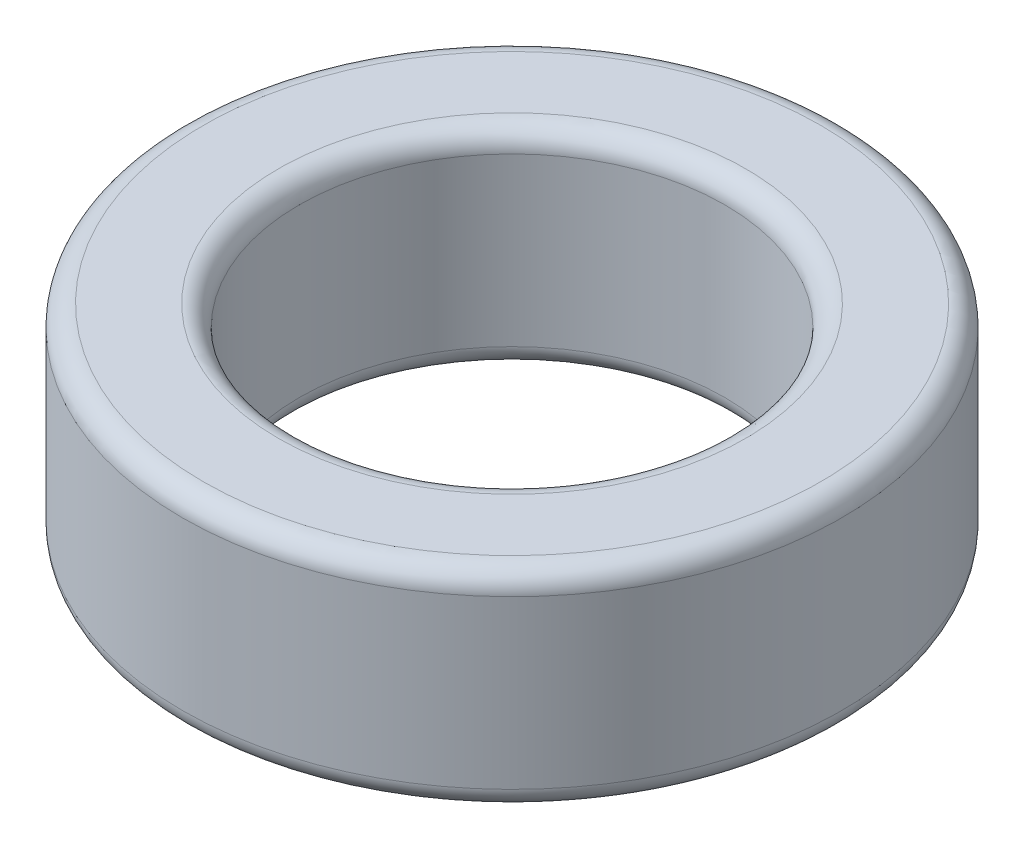
ISO-10303-21;
HEADER;
FILE_DESCRIPTION(('STEP AP214'),'2;1');
FILE_NAME('part.step','',(''),(''),'','','');
FILE_SCHEMA(('AUTOMOTIVE_DESIGN { 1 0 10303 214 1 1 1 1 }'));
ENDSEC;
DATA;
#1=APPLICATION_CONTEXT('core data for automotive mechanical design processes');
#2=APPLICATION_PROTOCOL_DEFINITION('international standard','automotive_design',2000,#1);
#3=PRODUCT_CONTEXT('',#1,'mechanical');
#4=PRODUCT('Part','Part','',(#3));
#5=PRODUCT_RELATED_PRODUCT_CATEGORY('part','',(#4));
#6=PRODUCT_DEFINITION_FORMATION('','',#4);
#7=PRODUCT_DEFINITION_CONTEXT('part definition',#1,'design');
#8=PRODUCT_DEFINITION('design','',#6,#7);
#9=PRODUCT_DEFINITION_SHAPE('','',#8);
#10=(LENGTH_UNIT() NAMED_UNIT(*) SI_UNIT(.MILLI.,.METRE.));
#11=(NAMED_UNIT(*) PLANE_ANGLE_UNIT() SI_UNIT($,.RADIAN.));
#12=(NAMED_UNIT(*) SI_UNIT($,.STERADIAN.) SOLID_ANGLE_UNIT());
#13=UNCERTAINTY_MEASURE_WITH_UNIT(LENGTH_MEASURE(1.E-05),#10,'distance_accuracy_value','');
#14=(GEOMETRIC_REPRESENTATION_CONTEXT(3) GLOBAL_UNCERTAINTY_ASSIGNED_CONTEXT((#13)) GLOBAL_UNIT_ASSIGNED_CONTEXT((#10,
#11,#12)) REPRESENTATION_CONTEXT('',''));
#15=CARTESIAN_POINT('',(0.,0.,0.));
#16=DIRECTION('',(0.,0.,1.));
#17=DIRECTION('',(1.,0.,0.));
#18=AXIS2_PLACEMENT_3D('',#15,#16,#17);
#19=CARTESIAN_POINT('',(0.,5.,0.));
#20=DIRECTION('',(0.,1.,0.));
#21=DIRECTION('',(0.,0.,1.));
#22=AXIS2_PLACEMENT_3D('',#19,#20,#21);
#23=PLANE('',#22);
#24=CARTESIAN_POINT('',(0.,5.,0.));
#25=DIRECTION('',(0.,1.,0.));
#26=DIRECTION('',(0.,0.,1.));
#27=AXIS2_PLACEMENT_3D('',#24,#25,#26);
#28=CIRCLE('',#27,5.6);
#29=CARTESIAN_POINT('',(0.,5.,5.6));
#30=VERTEX_POINT('',#29);
#31=EDGE_CURVE('E10',#30,#30,#28,.F.);
#32=ORIENTED_EDGE('',*,*,#31,.T.);
#33=EDGE_LOOP('',(#32));
#34=FACE_BOUND('',#33,.T.);
#35=CARTESIAN_POINT('',(0.,5.,0.));
#36=DIRECTION('',(0.,1.,0.));
#37=DIRECTION('',(0.,0.,1.));
#38=AXIS2_PLACEMENT_3D('',#35,#36,#37);
#39=CIRCLE('',#38,7.4);
#40=CARTESIAN_POINT('',(0.,5.,7.4));
#41=VERTEX_POINT('',#40);
#42=EDGE_CURVE('E45',#41,#41,#39,.T.);
#43=ORIENTED_EDGE('',*,*,#42,.T.);
#44=EDGE_LOOP('',(#43));
#45=FACE_BOUND('',#44,.T.);
#46=ADVANCED_FACE('F37',(#34,#45),#23,.T.);
#47=CARTESIAN_POINT('',(0.,0.,0.));
#48=DIRECTION('',(0.,1.,0.));
#49=DIRECTION('',(0.,0.,1.));
#50=AXIS2_PLACEMENT_3D('',#47,#48,#49);
#51=PLANE('',#50);
#52=CARTESIAN_POINT('',(0.,0.,0.));
#53=DIRECTION('',(0.,1.,0.));
#54=DIRECTION('',(0.,0.,1.));
#55=AXIS2_PLACEMENT_3D('',#52,#53,#54);
#56=CIRCLE('',#55,7.4);
#57=CARTESIAN_POINT('',(0.,0.,7.4));
#58=VERTEX_POINT('',#57);
#59=EDGE_CURVE('E61',#58,#58,#56,.F.);
#60=ORIENTED_EDGE('',*,*,#59,.T.);
#61=EDGE_LOOP('',(#60));
#62=FACE_BOUND('',#61,.T.);
#63=CARTESIAN_POINT('',(0.,0.,0.));
#64=DIRECTION('',(0.,1.,0.));
#65=DIRECTION('',(0.,0.,1.));
#66=AXIS2_PLACEMENT_3D('',#63,#64,#65);
#67=CIRCLE('',#66,5.6);
#68=CARTESIAN_POINT('',(0.,0.,5.6));
#69=VERTEX_POINT('',#68);
#70=EDGE_CURVE('E65',#69,#69,#67,.T.);
#71=ORIENTED_EDGE('',*,*,#70,.T.);
#72=EDGE_LOOP('',(#71));
#73=FACE_BOUND('',#72,.T.);
#74=ADVANCED_FACE('F89',(#62,#73),#51,.F.);
#75=CARTESIAN_POINT('',(0.,5.,0.));
#76=DIRECTION('',(0.,-1.,0.));
#77=DIRECTION('',(0.,0.,-1.));
#78=AXIS2_PLACEMENT_3D('',#75,#76,#77);
#79=CYLINDRICAL_SURFACE('',#78,7.9);
#80=CARTESIAN_POINT('',(0.,0.5,0.));
#81=DIRECTION('',(0.,1.,0.));
#82=DIRECTION('',(0.,0.,1.));
#83=AXIS2_PLACEMENT_3D('',#80,#81,#82);
#84=CIRCLE('',#83,7.9);
#85=CARTESIAN_POINT('',(0.,0.5,7.9));
#86=VERTEX_POINT('',#85);
#87=EDGE_CURVE('E69',#86,#86,#84,.T.);
#88=ORIENTED_EDGE('',*,*,#87,.T.);
#89=EDGE_LOOP('',(#88));
#90=FACE_BOUND('',#89,.T.);
#91=CARTESIAN_POINT('',(0.,4.5,0.));
#92=DIRECTION('',(0.,1.,0.));
#93=DIRECTION('',(0.,0.,1.));
#94=AXIS2_PLACEMENT_3D('',#91,#92,#93);
#95=CIRCLE('',#94,7.9);
#96=CARTESIAN_POINT('',(0.,4.5,7.9));
#97=VERTEX_POINT('',#96);
#98=EDGE_CURVE('E73',#97,#97,#95,.F.);
#99=ORIENTED_EDGE('',*,*,#98,.T.);
#100=EDGE_LOOP('',(#99));
#101=FACE_BOUND('',#100,.T.);
#102=ADVANCED_FACE('F78',(#90,#101),#79,.T.);
#103=CARTESIAN_POINT('',(0.,5.,0.));
#104=DIRECTION('',(0.,-1.,0.));
#105=DIRECTION('',(0.,0.,-1.));
#106=AXIS2_PLACEMENT_3D('',#103,#104,#105);
#107=CYLINDRICAL_SURFACE('',#106,5.1);
#108=CARTESIAN_POINT('',(0.,0.5,0.));
#109=DIRECTION('',(0.,1.,0.));
#110=DIRECTION('',(0.,0.,1.));
#111=AXIS2_PLACEMENT_3D('',#108,#109,#110);
#112=CIRCLE('',#111,5.1);
#113=CARTESIAN_POINT('',(0.,0.5,5.1));
#114=VERTEX_POINT('',#113);
#115=EDGE_CURVE('E50',#114,#114,#112,.F.);
#116=ORIENTED_EDGE('',*,*,#115,.T.);
#117=EDGE_LOOP('',(#116));
#118=FACE_BOUND('',#117,.T.);
#119=CARTESIAN_POINT('',(0.,4.5,0.));
#120=DIRECTION('',(0.,1.,0.));
#121=DIRECTION('',(0.,0.,1.));
#122=AXIS2_PLACEMENT_3D('',#119,#120,#121);
#123=CIRCLE('',#122,5.1);
#124=CARTESIAN_POINT('',(0.,4.5,5.1));
#125=VERTEX_POINT('',#124);
#126=EDGE_CURVE('E55',#125,#125,#123,.T.);
#127=ORIENTED_EDGE('',*,*,#126,.T.);
#128=EDGE_LOOP('',(#127));
#129=FACE_BOUND('',#128,.T.);
#130=ADVANCED_FACE('F97',(#118,#129),#107,.F.);
#131=CARTESIAN_POINT('',(0.,0.5,0.));
#132=DIRECTION('',(0.,1.,0.));
#133=DIRECTION('',(0.,0.,1.));
#134=AXIS2_PLACEMENT_3D('',#131,#132,#133);
#135=TOROIDAL_SURFACE('',#134,7.4,0.5);
#136=ORIENTED_EDGE('',*,*,#59,.F.);
#137=EDGE_LOOP('',(#136));
#138=FACE_BOUND('',#137,.T.);
#139=ORIENTED_EDGE('',*,*,#87,.F.);
#140=EDGE_LOOP('',(#139));
#141=FACE_BOUND('',#140,.T.);
#142=ADVANCED_FACE('F102',(#138,#141),#135,.T.);
#143=CARTESIAN_POINT('',(0.,0.5,0.));
#144=DIRECTION('',(0.,1.,0.));
#145=DIRECTION('',(0.,0.,1.));
#146=AXIS2_PLACEMENT_3D('',#143,#144,#145);
#147=TOROIDAL_SURFACE('',#146,5.6,0.5);
#148=ORIENTED_EDGE('',*,*,#115,.F.);
#149=EDGE_LOOP('',(#148));
#150=FACE_BOUND('',#149,.T.);
#151=ORIENTED_EDGE('',*,*,#70,.F.);
#152=EDGE_LOOP('',(#151));
#153=FACE_BOUND('',#152,.T.);
#154=ADVANCED_FACE('F86',(#150,#153),#147,.T.);
#155=CARTESIAN_POINT('',(0.,4.5,0.));
#156=DIRECTION('',(0.,1.,0.));
#157=DIRECTION('',(0.,0.,1.));
#158=AXIS2_PLACEMENT_3D('',#155,#156,#157);
#159=TOROIDAL_SURFACE('',#158,5.6,0.5);
#160=ORIENTED_EDGE('',*,*,#31,.F.);
#161=EDGE_LOOP('',(#160));
#162=FACE_BOUND('',#161,.T.);
#163=ORIENTED_EDGE('',*,*,#126,.F.);
#164=EDGE_LOOP('',(#163));
#165=FACE_BOUND('',#164,.T.);
#166=ADVANCED_FACE('F82',(#162,#165),#159,.T.);
#167=CARTESIAN_POINT('',(0.,4.5,0.));
#168=DIRECTION('',(0.,1.,0.));
#169=DIRECTION('',(0.,0.,1.));
#170=AXIS2_PLACEMENT_3D('',#167,#168,#169);
#171=TOROIDAL_SURFACE('',#170,7.4,0.5);
#172=ORIENTED_EDGE('',*,*,#98,.F.);
#173=EDGE_LOOP('',(#172));
#174=FACE_BOUND('',#173,.T.);
#175=ORIENTED_EDGE('',*,*,#42,.F.);
#176=EDGE_LOOP('',(#175));
#177=FACE_BOUND('',#176,.T.);
#178=ADVANCED_FACE('F39',(#174,#177),#171,.T.);
#179=CLOSED_SHELL('',(#46,#74,#102,#130,#142,#154,#166,#178));
#180=MANIFOLD_SOLID_BREP('B2',#179);
#181=ADVANCED_BREP_SHAPE_REPRESENTATION('',(#18,#180),#14);
#182=SHAPE_DEFINITION_REPRESENTATION(#9,#181);
ENDSEC;
END-ISO-10303-21;
